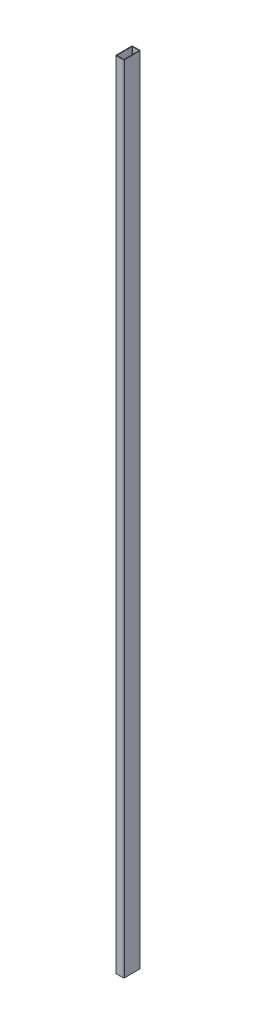
ISO-10303-21;
HEADER;
FILE_DESCRIPTION(('STEP AP214'),'2;1');
FILE_NAME('part.step','',(''),(''),'','','');
FILE_SCHEMA(('AUTOMOTIVE_DESIGN { 1 0 10303 214 1 1 1 1 }'));
ENDSEC;
DATA;
#1=APPLICATION_CONTEXT('core data for automotive mechanical design processes');
#2=APPLICATION_PROTOCOL_DEFINITION('international standard','automotive_design',2000,#1);
#3=PRODUCT_CONTEXT('',#1,'mechanical');
#4=PRODUCT('Part','Part','',(#3));
#5=PRODUCT_RELATED_PRODUCT_CATEGORY('part','',(#4));
#6=PRODUCT_DEFINITION_FORMATION('','',#4);
#7=PRODUCT_DEFINITION_CONTEXT('part definition',#1,'design');
#8=PRODUCT_DEFINITION('design','',#6,#7);
#9=PRODUCT_DEFINITION_SHAPE('','',#8);
#10=(LENGTH_UNIT() NAMED_UNIT(*) SI_UNIT(.MILLI.,.METRE.));
#11=(NAMED_UNIT(*) PLANE_ANGLE_UNIT() SI_UNIT($,.RADIAN.));
#12=(NAMED_UNIT(*) SI_UNIT($,.STERADIAN.) SOLID_ANGLE_UNIT());
#13=UNCERTAINTY_MEASURE_WITH_UNIT(LENGTH_MEASURE(1.E-05),#10,'distance_accuracy_value','');
#14=(GEOMETRIC_REPRESENTATION_CONTEXT(3) GLOBAL_UNCERTAINTY_ASSIGNED_CONTEXT((#13)) GLOBAL_UNIT_ASSIGNED_CONTEXT((#10,
#11,#12)) REPRESENTATION_CONTEXT('',''));
#15=CARTESIAN_POINT('',(0.,0.,0.));
#16=DIRECTION('',(0.,0.,1.));
#17=DIRECTION('',(1.,0.,0.));
#18=AXIS2_PLACEMENT_3D('',#15,#16,#17);
#19=CARTESIAN_POINT('',(20.0000000000001,1964.72135955,-18.5));
#20=DIRECTION('',(-1.,0.,0.));
#21=DIRECTION('',(0.,0.,1.));
#22=AXIS2_PLACEMENT_3D('',#19,#20,#21);
#23=PLANE('',#22);
#24=DIRECTION('',(0.,0.,-1.));
#25=VECTOR('',#24,1.);
#26=CARTESIAN_POINT('',(20.0000000000001,1920.,-18.5));
#27=LINE('',#26,#25);
#28=CARTESIAN_POINT('',(20.0000000000001,1920.,18.4999999999999));
#29=VERTEX_POINT('',#28);
#30=CARTESIAN_POINT('',(20.0000000000001,1920.,-18.5));
#31=VERTEX_POINT('',#30);
#32=EDGE_CURVE('E306',#29,#31,#27,.T.);
#33=ORIENTED_EDGE('',*,*,#32,.F.);
#34=DIRECTION('',(0.,-1.,0.));
#35=VECTOR('',#34,1.);
#36=CARTESIAN_POINT('',(20.0000000000001,1964.72135955,18.4999999999999));
#37=LINE('',#36,#35);
#38=CARTESIAN_POINT('',(20.0000000000001,0.,18.4999999999999));
#39=VERTEX_POINT('',#38);
#40=EDGE_CURVE('E50',#29,#39,#37,.T.);
#41=ORIENTED_EDGE('',*,*,#40,.T.);
#42=DIRECTION('',(0.,0.,-1.));
#43=VECTOR('',#42,1.);
#44=CARTESIAN_POINT('',(20.0000000000001,0.,-18.5));
#45=LINE('',#44,#43);
#46=CARTESIAN_POINT('',(20.0000000000001,0.,-18.5));
#47=VERTEX_POINT('',#46);
#48=EDGE_CURVE('E201',#39,#47,#45,.T.);
#49=ORIENTED_EDGE('',*,*,#48,.T.);
#50=DIRECTION('',(0.,-1.,0.));
#51=VECTOR('',#50,1.);
#52=CARTESIAN_POINT('',(20.0000000000001,1964.72135955,-18.5));
#53=LINE('',#52,#51);
#54=EDGE_CURVE('E204',#31,#47,#53,.T.);
#55=ORIENTED_EDGE('',*,*,#54,.F.);
#56=EDGE_LOOP('',(#33,#41,#49,#55));
#57=FACE_BOUND('',#56,.T.);
#58=ADVANCED_FACE('F35',(#57),#23,.F.);
#59=CARTESIAN_POINT('',(18.5000000000001,1964.72135955,18.4999999999999));
#60=DIRECTION('',(0.,-1.,0.));
#61=DIRECTION('',(0.,0.,-1.));
#62=AXIS2_PLACEMENT_3D('',#59,#60,#61);
#63=CYLINDRICAL_SURFACE('',#62,1.5);
#64=CARTESIAN_POINT('',(18.5000000000001,1920.,18.4999999999999));
#65=DIRECTION('',(0.,1.,0.));
#66=DIRECTION('',(0.,0.,1.));
#67=AXIS2_PLACEMENT_3D('',#64,#65,#66);
#68=CIRCLE('',#67,1.5);
#69=CARTESIAN_POINT('',(18.5000000000001,1920.,19.9999999999999));
#70=VERTEX_POINT('',#69);
#71=EDGE_CURVE('E242',#70,#29,#68,.T.);
#72=ORIENTED_EDGE('',*,*,#71,.F.);
#73=DIRECTION('',(0.,-1.,0.));
#74=VECTOR('',#73,1.);
#75=CARTESIAN_POINT('',(18.5000000000001,1964.72135955,19.9999999999999));
#76=LINE('',#75,#74);
#77=CARTESIAN_POINT('',(18.5000000000001,0.,19.9999999999999));
#78=VERTEX_POINT('',#77);
#79=EDGE_CURVE('E207',#70,#78,#76,.T.);
#80=ORIENTED_EDGE('',*,*,#79,.T.);
#81=CARTESIAN_POINT('',(18.5000000000001,0.,18.4999999999999));
#82=DIRECTION('',(0.,1.,0.));
#83=DIRECTION('',(0.,0.,-1.));
#84=AXIS2_PLACEMENT_3D('',#81,#82,#83);
#85=CIRCLE('',#84,1.5);
#86=EDGE_CURVE('E199',#78,#39,#85,.T.);
#87=ORIENTED_EDGE('',*,*,#86,.T.);
#88=ORIENTED_EDGE('',*,*,#40,.F.);
#89=EDGE_LOOP('',(#72,#80,#87,#88));
#90=FACE_BOUND('',#89,.T.);
#91=ADVANCED_FACE('F239',(#90),#63,.T.);
#92=CARTESIAN_POINT('',(1.50000000000008,1964.72135955,19.9999999999999));
#93=DIRECTION('',(0.,0.,-1.));
#94=DIRECTION('',(-1.,0.,0.));
#95=AXIS2_PLACEMENT_3D('',#92,#93,#94);
#96=PLANE('',#95);
#97=DIRECTION('',(1.,0.,0.));
#98=VECTOR('',#97,1.);
#99=CARTESIAN_POINT('',(1.50000000000008,1920.,19.9999999999999));
#100=LINE('',#99,#98);
#101=CARTESIAN_POINT('',(1.50000000000008,1920.,19.9999999999999));
#102=VERTEX_POINT('',#101);
#103=EDGE_CURVE('E247',#102,#70,#100,.T.);
#104=ORIENTED_EDGE('',*,*,#103,.F.);
#105=DIRECTION('',(0.,-1.,0.));
#106=VECTOR('',#105,1.);
#107=CARTESIAN_POINT('',(1.50000000000008,1964.72135955,19.9999999999999));
#108=LINE('',#107,#106);
#109=CARTESIAN_POINT('',(1.50000000000008,0.,19.9999999999999));
#110=VERTEX_POINT('',#109);
#111=EDGE_CURVE('E209',#102,#110,#108,.T.);
#112=ORIENTED_EDGE('',*,*,#111,.T.);
#113=DIRECTION('',(1.,0.,0.));
#114=VECTOR('',#113,1.);
#115=CARTESIAN_POINT('',(1.50000000000008,0.,19.9999999999999));
#116=LINE('',#115,#114);
#117=EDGE_CURVE('E196',#110,#78,#116,.T.);
#118=ORIENTED_EDGE('',*,*,#117,.T.);
#119=ORIENTED_EDGE('',*,*,#79,.F.);
#120=EDGE_LOOP('',(#104,#112,#118,#119));
#121=FACE_BOUND('',#120,.T.);
#122=ADVANCED_FACE('F245',(#121),#96,.F.);
#123=CARTESIAN_POINT('',(1.50000000000008,1964.72135955,18.4999999999999));
#124=DIRECTION('',(0.,-1.,0.));
#125=DIRECTION('',(0.,0.,-1.));
#126=AXIS2_PLACEMENT_3D('',#123,#124,#125);
#127=CYLINDRICAL_SURFACE('',#126,1.5);
#128=CARTESIAN_POINT('',(1.50000000000008,1920.,18.4999999999999));
#129=DIRECTION('',(0.,1.,0.));
#130=DIRECTION('',(0.,0.,1.));
#131=AXIS2_PLACEMENT_3D('',#128,#129,#130);
#132=CIRCLE('',#131,1.5);
#133=CARTESIAN_POINT('',(0.,1920.,18.4999999999999));
#134=VERTEX_POINT('',#133);
#135=EDGE_CURVE('E310',#134,#102,#132,.T.);
#136=ORIENTED_EDGE('',*,*,#135,.F.);
#137=DIRECTION('',(0.,-1.,0.));
#138=VECTOR('',#137,1.);
#139=CARTESIAN_POINT('',(0.,1964.72135955,18.4999999999999));
#140=LINE('',#139,#138);
#141=CARTESIAN_POINT('',(0.,0.,18.4999999999999));
#142=VERTEX_POINT('',#141);
#143=EDGE_CURVE('E211',#134,#142,#140,.T.);
#144=ORIENTED_EDGE('',*,*,#143,.T.);
#145=CARTESIAN_POINT('',(1.50000000000008,0.,18.4999999999999));
#146=DIRECTION('',(0.,1.,0.));
#147=DIRECTION('',(0.,0.,1.));
#148=AXIS2_PLACEMENT_3D('',#145,#146,#147);
#149=CIRCLE('',#148,1.5);
#150=EDGE_CURVE('E193',#142,#110,#149,.T.);
#151=ORIENTED_EDGE('',*,*,#150,.T.);
#152=ORIENTED_EDGE('',*,*,#111,.F.);
#153=EDGE_LOOP('',(#136,#144,#151,#152));
#154=FACE_BOUND('',#153,.T.);
#155=ADVANCED_FACE('F250',(#154),#127,.T.);
#156=CARTESIAN_POINT('',(0.,1964.72135955,-18.5000000000001));
#157=DIRECTION('',(1.,0.,0.));
#158=DIRECTION('',(0.,0.,-1.));
#159=AXIS2_PLACEMENT_3D('',#156,#157,#158);
#160=PLANE('',#159);
#161=DIRECTION('',(0.,0.,1.));
#162=VECTOR('',#161,1.);
#163=CARTESIAN_POINT('',(0.,1920.,-18.5000000000001));
#164=LINE('',#163,#162);
#165=CARTESIAN_POINT('',(0.,1920.,-18.5000000000001));
#166=VERTEX_POINT('',#165);
#167=EDGE_CURVE('E256',#166,#134,#164,.T.);
#168=ORIENTED_EDGE('',*,*,#167,.F.);
#169=DIRECTION('',(0.,-1.,0.));
#170=VECTOR('',#169,1.);
#171=CARTESIAN_POINT('',(0.,1964.72135955,-18.5000000000001));
#172=LINE('',#171,#170);
#173=CARTESIAN_POINT('',(0.,0.,-18.5000000000001));
#174=VERTEX_POINT('',#173);
#175=EDGE_CURVE('E213',#166,#174,#172,.T.);
#176=ORIENTED_EDGE('',*,*,#175,.T.);
#177=DIRECTION('',(0.,0.,1.));
#178=VECTOR('',#177,1.);
#179=CARTESIAN_POINT('',(0.,0.,-18.5000000000001));
#180=LINE('',#179,#178);
#181=EDGE_CURVE('E190',#174,#142,#180,.T.);
#182=ORIENTED_EDGE('',*,*,#181,.T.);
#183=ORIENTED_EDGE('',*,*,#143,.F.);
#184=EDGE_LOOP('',(#168,#176,#182,#183));
#185=FACE_BOUND('',#184,.T.);
#186=ADVANCED_FACE('F253',(#185),#160,.F.);
#187=CARTESIAN_POINT('',(1.50000000000008,1964.72135955,-18.5000000000001));
#188=DIRECTION('',(0.,-1.,0.));
#189=DIRECTION('',(0.,0.,-1.));
#190=AXIS2_PLACEMENT_3D('',#187,#188,#189);
#191=CYLINDRICAL_SURFACE('',#190,1.50000000000001);
#192=CARTESIAN_POINT('',(1.50000000000008,1920.,-18.5000000000001));
#193=DIRECTION('',(0.,1.,0.));
#194=DIRECTION('',(0.,0.,1.));
#195=AXIS2_PLACEMENT_3D('',#192,#193,#194);
#196=CIRCLE('',#195,1.50000000000001);
#197=CARTESIAN_POINT('',(1.50000000000008,1920.,-20.0000000000001));
#198=VERTEX_POINT('',#197);
#199=EDGE_CURVE('E260',#198,#166,#196,.T.);
#200=ORIENTED_EDGE('',*,*,#199,.F.);
#201=DIRECTION('',(0.,-1.,0.));
#202=VECTOR('',#201,1.);
#203=CARTESIAN_POINT('',(1.50000000000008,1964.72135955,-20.0000000000001));
#204=LINE('',#203,#202);
#205=CARTESIAN_POINT('',(1.50000000000008,0.,-20.0000000000001));
#206=VERTEX_POINT('',#205);
#207=EDGE_CURVE('E215',#198,#206,#204,.T.);
#208=ORIENTED_EDGE('',*,*,#207,.T.);
#209=CARTESIAN_POINT('',(1.50000000000008,0.,-18.5000000000001));
#210=DIRECTION('',(0.,1.,0.));
#211=DIRECTION('',(0.,0.,-1.));
#212=AXIS2_PLACEMENT_3D('',#209,#210,#211);
#213=CIRCLE('',#212,1.50000000000001);
#214=EDGE_CURVE('E187',#206,#174,#213,.T.);
#215=ORIENTED_EDGE('',*,*,#214,.T.);
#216=ORIENTED_EDGE('',*,*,#175,.F.);
#217=EDGE_LOOP('',(#200,#208,#215,#216));
#218=FACE_BOUND('',#217,.T.);
#219=ADVANCED_FACE('F259',(#218),#191,.T.);
#220=CARTESIAN_POINT('',(1.50000000000008,1964.72135955,-20.0000000000001));
#221=DIRECTION('',(0.,0.,1.));
#222=DIRECTION('',(1.,0.,0.));
#223=AXIS2_PLACEMENT_3D('',#220,#221,#222);
#224=PLANE('',#223);
#225=DIRECTION('',(-1.,0.,0.));
#226=VECTOR('',#225,1.);
#227=CARTESIAN_POINT('',(1.50000000000008,1920.,-20.0000000000001));
#228=LINE('',#227,#226);
#229=CARTESIAN_POINT('',(18.5000000000001,1920.,-20.0000000000001));
#230=VERTEX_POINT('',#229);
#231=EDGE_CURVE('E223',#230,#198,#228,.T.);
#232=ORIENTED_EDGE('',*,*,#231,.F.);
#233=DIRECTION('',(0.,-1.,0.));
#234=VECTOR('',#233,1.);
#235=CARTESIAN_POINT('',(18.5000000000001,1964.72135955,-20.0000000000001));
#236=LINE('',#235,#234);
#237=CARTESIAN_POINT('',(18.5000000000001,0.,-20.0000000000001));
#238=VERTEX_POINT('',#237);
#239=EDGE_CURVE('E43',#230,#238,#236,.T.);
#240=ORIENTED_EDGE('',*,*,#239,.T.);
#241=DIRECTION('',(-1.,0.,0.));
#242=VECTOR('',#241,1.);
#243=CARTESIAN_POINT('',(1.50000000000008,0.,-20.0000000000001));
#244=LINE('',#243,#242);
#245=EDGE_CURVE('E184',#238,#206,#244,.T.);
#246=ORIENTED_EDGE('',*,*,#245,.T.);
#247=ORIENTED_EDGE('',*,*,#207,.F.);
#248=EDGE_LOOP('',(#232,#240,#246,#247));
#249=FACE_BOUND('',#248,.T.);
#250=ADVANCED_FACE('F219',(#249),#224,.F.);
#251=CARTESIAN_POINT('',(18.5000000000001,1964.72135955,-18.5));
#252=DIRECTION('',(0.,-1.,0.));
#253=DIRECTION('',(0.,0.,-1.));
#254=AXIS2_PLACEMENT_3D('',#251,#252,#253);
#255=CYLINDRICAL_SURFACE('',#254,1.5);
#256=CARTESIAN_POINT('',(18.5000000000001,1920.,-18.5));
#257=DIRECTION('',(0.,1.,0.));
#258=DIRECTION('',(0.,0.,1.));
#259=AXIS2_PLACEMENT_3D('',#256,#257,#258);
#260=CIRCLE('',#259,1.5);
#261=EDGE_CURVE('E233',#31,#230,#260,.T.);
#262=ORIENTED_EDGE('',*,*,#261,.F.);
#263=ORIENTED_EDGE('',*,*,#54,.T.);
#264=CARTESIAN_POINT('',(18.5000000000001,0.,-18.5));
#265=DIRECTION('',(0.,1.,0.));
#266=DIRECTION('',(0.,0.,-1.));
#267=AXIS2_PLACEMENT_3D('',#264,#265,#266);
#268=CIRCLE('',#267,1.5);
#269=EDGE_CURVE('E181',#47,#238,#268,.T.);
#270=ORIENTED_EDGE('',*,*,#269,.T.);
#271=ORIENTED_EDGE('',*,*,#239,.F.);
#272=EDGE_LOOP('',(#262,#263,#270,#271));
#273=FACE_BOUND('',#272,.T.);
#274=ADVANCED_FACE('F37',(#273),#255,.T.);
#275=CARTESIAN_POINT('',(18.5000000000001,0.,-18.5));
#276=DIRECTION('',(0.,-1.,0.));
#277=DIRECTION('',(0.,0.,-1.));
#278=AXIS2_PLACEMENT_3D('',#275,#276,#277);
#279=PLANE('',#278);
#280=ORIENTED_EDGE('',*,*,#269,.F.);
#281=ORIENTED_EDGE('',*,*,#48,.F.);
#282=ORIENTED_EDGE('',*,*,#86,.F.);
#283=ORIENTED_EDGE('',*,*,#117,.F.);
#284=ORIENTED_EDGE('',*,*,#150,.F.);
#285=ORIENTED_EDGE('',*,*,#181,.F.);
#286=ORIENTED_EDGE('',*,*,#214,.F.);
#287=ORIENTED_EDGE('',*,*,#245,.F.);
#288=EDGE_LOOP('',(#280,#281,#282,#283,#284,#285,#286,#287));
#289=FACE_BOUND('',#288,.T.);
#290=DIRECTION('',(1.,0.,0.));
#291=VECTOR('',#290,1.);
#292=CARTESIAN_POINT('',(2.50000000000008,0.,18.4999999999999));
#293=LINE('',#292,#291);
#294=CARTESIAN_POINT('',(2.50000000000008,0.,18.4999999999999));
#295=VERTEX_POINT('',#294);
#296=CARTESIAN_POINT('',(17.5000000000001,0.,18.4999999999999));
#297=VERTEX_POINT('',#296);
#298=EDGE_CURVE('E163',#295,#297,#293,.T.);
#299=ORIENTED_EDGE('',*,*,#298,.T.);
#300=CARTESIAN_POINT('',(17.5000000000001,0.,17.4999999999999));
#301=DIRECTION('',(0.,1.,0.));
#302=DIRECTION('',(0.,0.,-1.));
#303=AXIS2_PLACEMENT_3D('',#300,#301,#302);
#304=CIRCLE('',#303,0.999999999999994);
#305=CARTESIAN_POINT('',(18.5000000000001,0.,17.4999999999999));
#306=VERTEX_POINT('',#305);
#307=EDGE_CURVE('E262',#297,#306,#304,.T.);
#308=ORIENTED_EDGE('',*,*,#307,.T.);
#309=DIRECTION('',(0.,0.,-1.));
#310=VECTOR('',#309,1.);
#311=CARTESIAN_POINT('',(18.5000000000001,0.,-17.5));
#312=LINE('',#311,#310);
#313=CARTESIAN_POINT('',(18.5000000000001,0.,-17.5));
#314=VERTEX_POINT('',#313);
#315=EDGE_CURVE('E269',#306,#314,#312,.T.);
#316=ORIENTED_EDGE('',*,*,#315,.T.);
#317=CARTESIAN_POINT('',(17.5000000000001,0.,-17.5));
#318=DIRECTION('',(0.,1.,0.));
#319=DIRECTION('',(0.,0.,-1.));
#320=AXIS2_PLACEMENT_3D('',#317,#318,#319);
#321=CIRCLE('',#320,1.);
#322=CARTESIAN_POINT('',(17.5000000000001,0.,-18.5000000000001));
#323=VERTEX_POINT('',#322);
#324=EDGE_CURVE('E272',#314,#323,#321,.T.);
#325=ORIENTED_EDGE('',*,*,#324,.T.);
#326=DIRECTION('',(-1.,0.,0.));
#327=VECTOR('',#326,1.);
#328=CARTESIAN_POINT('',(2.50000000000009,0.,-18.5000000000001));
#329=LINE('',#328,#327);
#330=CARTESIAN_POINT('',(2.50000000000009,0.,-18.5000000000001));
#331=VERTEX_POINT('',#330);
#332=EDGE_CURVE('E275',#323,#331,#329,.T.);
#333=ORIENTED_EDGE('',*,*,#332,.T.);
#334=CARTESIAN_POINT('',(2.50000000000009,0.,-17.5000000000001));
#335=DIRECTION('',(0.,1.,0.));
#336=DIRECTION('',(0.,0.,-1.));
#337=AXIS2_PLACEMENT_3D('',#334,#335,#336);
#338=CIRCLE('',#337,1.);
#339=CARTESIAN_POINT('',(1.50000000000008,0.,-17.5000000000001));
#340=VERTEX_POINT('',#339);
#341=EDGE_CURVE('E278',#331,#340,#338,.T.);
#342=ORIENTED_EDGE('',*,*,#341,.T.);
#343=DIRECTION('',(0.,0.,1.));
#344=VECTOR('',#343,1.);
#345=CARTESIAN_POINT('',(1.50000000000008,0.,-17.5000000000001));
#346=LINE('',#345,#344);
#347=CARTESIAN_POINT('',(1.50000000000009,0.,17.4999999999999));
#348=VERTEX_POINT('',#347);
#349=EDGE_CURVE('E281',#340,#348,#346,.T.);
#350=ORIENTED_EDGE('',*,*,#349,.T.);
#351=CARTESIAN_POINT('',(2.50000000000008,0.,17.4999999999999));
#352=DIRECTION('',(0.,1.,0.));
#353=DIRECTION('',(0.,0.,1.));
#354=AXIS2_PLACEMENT_3D('',#351,#352,#353);
#355=CIRCLE('',#354,0.999999999999997);
#356=EDGE_CURVE('E284',#348,#295,#355,.T.);
#357=ORIENTED_EDGE('',*,*,#356,.T.);
#358=EDGE_LOOP('',(#299,#308,#316,#325,#333,#342,#350,#357));
#359=FACE_BOUND('',#358,.T.);
#360=ADVANCED_FACE('F229',(#289,#359),#279,.T.);
#361=CARTESIAN_POINT('',(2.50000000000008,1964.72135955,18.4999999999999));
#362=DIRECTION('',(0.,0.,-1.));
#363=DIRECTION('',(-1.,0.,0.));
#364=AXIS2_PLACEMENT_3D('',#361,#362,#363);
#365=PLANE('',#364);
#366=DIRECTION('',(0.,-1.,0.));
#367=VECTOR('',#366,1.);
#368=CARTESIAN_POINT('',(2.50000000000008,1964.72135955,18.4999999999999));
#369=LINE('',#368,#367);
#370=CARTESIAN_POINT('',(2.50000000000008,1920.,18.4999999999999));
#371=VERTEX_POINT('',#370);
#372=EDGE_CURVE('E155',#371,#295,#369,.T.);
#373=ORIENTED_EDGE('',*,*,#372,.F.);
#374=DIRECTION('',(1.,0.,0.));
#375=VECTOR('',#374,1.);
#376=CARTESIAN_POINT('',(2.50000000000008,1920.,18.4999999999999));
#377=LINE('',#376,#375);
#378=CARTESIAN_POINT('',(17.5000000000001,1920.,18.4999999999999));
#379=VERTEX_POINT('',#378);
#380=EDGE_CURVE('E11',#371,#379,#377,.T.);
#381=ORIENTED_EDGE('',*,*,#380,.T.);
#382=DIRECTION('',(0.,-1.,0.));
#383=VECTOR('',#382,1.);
#384=CARTESIAN_POINT('',(17.5000000000001,1964.72135955,18.4999999999999));
#385=LINE('',#384,#383);
#386=EDGE_CURVE('E165',#379,#297,#385,.T.);
#387=ORIENTED_EDGE('',*,*,#386,.T.);
#388=ORIENTED_EDGE('',*,*,#298,.F.);
#389=EDGE_LOOP('',(#373,#381,#387,#388));
#390=FACE_BOUND('',#389,.T.);
#391=ADVANCED_FACE('F161',(#390),#365,.T.);
#392=CARTESIAN_POINT('',(2.50000000000008,1964.72135955,17.4999999999999));
#393=DIRECTION('',(0.,-1.,0.));
#394=DIRECTION('',(0.,0.,-1.));
#395=AXIS2_PLACEMENT_3D('',#392,#393,#394);
#396=CYLINDRICAL_SURFACE('',#395,0.999999999999997);
#397=DIRECTION('',(0.,-1.,0.));
#398=VECTOR('',#397,1.);
#399=CARTESIAN_POINT('',(1.50000000000009,1964.72135955,17.4999999999999));
#400=LINE('',#399,#398);
#401=CARTESIAN_POINT('',(1.50000000000008,1920.,17.4999999999999));
#402=VERTEX_POINT('',#401);
#403=EDGE_CURVE('E157',#402,#348,#400,.T.);
#404=ORIENTED_EDGE('',*,*,#403,.F.);
#405=CARTESIAN_POINT('',(2.50000000000008,1920.,17.4999999999999));
#406=DIRECTION('',(0.,1.,0.));
#407=DIRECTION('',(0.,0.,1.));
#408=AXIS2_PLACEMENT_3D('',#405,#406,#407);
#409=CIRCLE('',#408,0.999999999999997);
#410=EDGE_CURVE('E148',#402,#371,#409,.T.);
#411=ORIENTED_EDGE('',*,*,#410,.T.);
#412=ORIENTED_EDGE('',*,*,#372,.T.);
#413=ORIENTED_EDGE('',*,*,#356,.F.);
#414=EDGE_LOOP('',(#404,#411,#412,#413));
#415=FACE_BOUND('',#414,.T.);
#416=ADVANCED_FACE('F153',(#415),#396,.F.);
#417=CARTESIAN_POINT('',(1.50000000000008,1964.72135955,-17.5000000000001));
#418=DIRECTION('',(1.,0.,0.));
#419=DIRECTION('',(0.,0.,-1.));
#420=AXIS2_PLACEMENT_3D('',#417,#418,#419);
#421=PLANE('',#420);
#422=DIRECTION('',(0.,-1.,0.));
#423=VECTOR('',#422,1.);
#424=CARTESIAN_POINT('',(1.50000000000008,1964.72135955,-17.5000000000001));
#425=LINE('',#424,#423);
#426=CARTESIAN_POINT('',(1.50000000000008,1920.,-17.5000000000001));
#427=VERTEX_POINT('',#426);
#428=EDGE_CURVE('E167',#427,#340,#425,.T.);
#429=ORIENTED_EDGE('',*,*,#428,.F.);
#430=DIRECTION('',(0.,0.,1.));
#431=VECTOR('',#430,1.);
#432=CARTESIAN_POINT('',(1.50000000000008,1920.,-17.5000000000001));
#433=LINE('',#432,#431);
#434=EDGE_CURVE('E159',#427,#402,#433,.T.);
#435=ORIENTED_EDGE('',*,*,#434,.T.);
#436=ORIENTED_EDGE('',*,*,#403,.T.);
#437=ORIENTED_EDGE('',*,*,#349,.F.);
#438=EDGE_LOOP('',(#429,#435,#436,#437));
#439=FACE_BOUND('',#438,.T.);
#440=ADVANCED_FACE('F290',(#439),#421,.T.);
#441=CARTESIAN_POINT('',(2.50000000000009,1964.72135955,-17.5000000000001));
#442=DIRECTION('',(0.,-1.,0.));
#443=DIRECTION('',(0.,0.,-1.));
#444=AXIS2_PLACEMENT_3D('',#441,#442,#443);
#445=CYLINDRICAL_SURFACE('',#444,1.);
#446=DIRECTION('',(0.,-1.,0.));
#447=VECTOR('',#446,1.);
#448=CARTESIAN_POINT('',(2.50000000000009,1964.72135955,-18.5000000000001));
#449=LINE('',#448,#447);
#450=CARTESIAN_POINT('',(2.50000000000009,1920.,-18.5000000000001));
#451=VERTEX_POINT('',#450);
#452=EDGE_CURVE('E173',#451,#331,#449,.T.);
#453=ORIENTED_EDGE('',*,*,#452,.F.);
#454=CARTESIAN_POINT('',(2.50000000000009,1920.,-17.5000000000001));
#455=DIRECTION('',(0.,1.,0.));
#456=DIRECTION('',(0.,0.,1.));
#457=AXIS2_PLACEMENT_3D('',#454,#455,#456);
#458=CIRCLE('',#457,1.);
#459=EDGE_CURVE('E292',#451,#427,#458,.T.);
#460=ORIENTED_EDGE('',*,*,#459,.T.);
#461=ORIENTED_EDGE('',*,*,#428,.T.);
#462=ORIENTED_EDGE('',*,*,#341,.F.);
#463=EDGE_LOOP('',(#453,#460,#461,#462));
#464=FACE_BOUND('',#463,.T.);
#465=ADVANCED_FACE('F327',(#464),#445,.F.);
#466=CARTESIAN_POINT('',(2.50000000000009,1964.72135955,-18.5000000000001));
#467=DIRECTION('',(0.,0.,1.));
#468=DIRECTION('',(1.,0.,0.));
#469=AXIS2_PLACEMENT_3D('',#466,#467,#468);
#470=PLANE('',#469);
#471=DIRECTION('',(0.,-1.,0.));
#472=VECTOR('',#471,1.);
#473=CARTESIAN_POINT('',(17.5000000000001,1964.72135955,-18.5000000000001));
#474=LINE('',#473,#472);
#475=CARTESIAN_POINT('',(17.5000000000001,1920.,-18.5000000000001));
#476=VERTEX_POINT('',#475);
#477=EDGE_CURVE('E175',#476,#323,#474,.T.);
#478=ORIENTED_EDGE('',*,*,#477,.F.);
#479=DIRECTION('',(-1.,0.,0.));
#480=VECTOR('',#479,1.);
#481=CARTESIAN_POINT('',(2.50000000000009,1920.,-18.5000000000001));
#482=LINE('',#481,#480);
#483=EDGE_CURVE('E294',#476,#451,#482,.T.);
#484=ORIENTED_EDGE('',*,*,#483,.T.);
#485=ORIENTED_EDGE('',*,*,#452,.T.);
#486=ORIENTED_EDGE('',*,*,#332,.F.);
#487=EDGE_LOOP('',(#478,#484,#485,#486));
#488=FACE_BOUND('',#487,.T.);
#489=ADVANCED_FACE('F324',(#488),#470,.T.);
#490=CARTESIAN_POINT('',(17.5000000000001,1964.72135955,-17.5));
#491=DIRECTION('',(0.,-1.,0.));
#492=DIRECTION('',(0.,0.,-1.));
#493=AXIS2_PLACEMENT_3D('',#490,#491,#492);
#494=CYLINDRICAL_SURFACE('',#493,1.);
#495=DIRECTION('',(0.,-1.,0.));
#496=VECTOR('',#495,1.);
#497=CARTESIAN_POINT('',(18.5000000000001,1964.72135955,-17.5));
#498=LINE('',#497,#496);
#499=CARTESIAN_POINT('',(18.5000000000001,1920.,-17.5));
#500=VERTEX_POINT('',#499);
#501=EDGE_CURVE('E177',#500,#314,#498,.T.);
#502=ORIENTED_EDGE('',*,*,#501,.F.);
#503=CARTESIAN_POINT('',(17.5000000000001,1920.,-17.5));
#504=DIRECTION('',(0.,1.,0.));
#505=DIRECTION('',(0.,0.,1.));
#506=AXIS2_PLACEMENT_3D('',#503,#504,#505);
#507=CIRCLE('',#506,1.);
#508=EDGE_CURVE('E299',#500,#476,#507,.T.);
#509=ORIENTED_EDGE('',*,*,#508,.T.);
#510=ORIENTED_EDGE('',*,*,#477,.T.);
#511=ORIENTED_EDGE('',*,*,#324,.F.);
#512=EDGE_LOOP('',(#502,#509,#510,#511));
#513=FACE_BOUND('',#512,.T.);
#514=ADVANCED_FACE('F321',(#513),#494,.F.);
#515=CARTESIAN_POINT('',(18.5000000000001,1964.72135955,-17.5));
#516=DIRECTION('',(-1.,0.,0.));
#517=DIRECTION('',(0.,0.,1.));
#518=AXIS2_PLACEMENT_3D('',#515,#516,#517);
#519=PLANE('',#518);
#520=DIRECTION('',(0.,-1.,0.));
#521=VECTOR('',#520,1.);
#522=CARTESIAN_POINT('',(18.5000000000001,1964.72135955,17.4999999999999));
#523=LINE('',#522,#521);
#524=CARTESIAN_POINT('',(18.5000000000001,1920.,17.4999999999999));
#525=VERTEX_POINT('',#524);
#526=EDGE_CURVE('E179',#525,#306,#523,.T.);
#527=ORIENTED_EDGE('',*,*,#526,.F.);
#528=DIRECTION('',(0.,0.,-1.));
#529=VECTOR('',#528,1.);
#530=CARTESIAN_POINT('',(18.5000000000001,1920.,-17.5));
#531=LINE('',#530,#529);
#532=EDGE_CURVE('E302',#525,#500,#531,.T.);
#533=ORIENTED_EDGE('',*,*,#532,.T.);
#534=ORIENTED_EDGE('',*,*,#501,.T.);
#535=ORIENTED_EDGE('',*,*,#315,.F.);
#536=EDGE_LOOP('',(#527,#533,#534,#535));
#537=FACE_BOUND('',#536,.T.);
#538=ADVANCED_FACE('F316',(#537),#519,.T.);
#539=CARTESIAN_POINT('',(17.5000000000001,1964.72135955,17.4999999999999));
#540=DIRECTION('',(0.,-1.,0.));
#541=DIRECTION('',(0.,0.,-1.));
#542=AXIS2_PLACEMENT_3D('',#539,#540,#541);
#543=CYLINDRICAL_SURFACE('',#542,0.999999999999994);
#544=ORIENTED_EDGE('',*,*,#386,.F.);
#545=CARTESIAN_POINT('',(17.5000000000001,1920.,17.4999999999999));
#546=DIRECTION('',(0.,1.,0.));
#547=DIRECTION('',(0.,0.,1.));
#548=AXIS2_PLACEMENT_3D('',#545,#546,#547);
#549=CIRCLE('',#548,0.999999999999994);
#550=EDGE_CURVE('E58',#379,#525,#549,.T.);
#551=ORIENTED_EDGE('',*,*,#550,.T.);
#552=ORIENTED_EDGE('',*,*,#526,.T.);
#553=ORIENTED_EDGE('',*,*,#307,.F.);
#554=EDGE_LOOP('',(#544,#551,#552,#553));
#555=FACE_BOUND('',#554,.T.);
#556=ADVANCED_FACE('F312',(#555),#543,.F.);
#557=CARTESIAN_POINT('',(1.49999999999998,1920.,1000.));
#558=DIRECTION('',(0.,1.,0.));
#559=DIRECTION('',(0.,0.,1.));
#560=AXIS2_PLACEMENT_3D('',#557,#558,#559);
#561=PLANE('',#560);
#562=ORIENTED_EDGE('',*,*,#550,.F.);
#563=ORIENTED_EDGE('',*,*,#380,.F.);
#564=ORIENTED_EDGE('',*,*,#410,.F.);
#565=ORIENTED_EDGE('',*,*,#434,.F.);
#566=ORIENTED_EDGE('',*,*,#459,.F.);
#567=ORIENTED_EDGE('',*,*,#483,.F.);
#568=ORIENTED_EDGE('',*,*,#508,.F.);
#569=ORIENTED_EDGE('',*,*,#532,.F.);
#570=EDGE_LOOP('',(#562,#563,#564,#565,#566,#567,#568,#569));
#571=FACE_BOUND('',#570,.T.);
#572=ORIENTED_EDGE('',*,*,#32,.T.);
#573=ORIENTED_EDGE('',*,*,#261,.T.);
#574=ORIENTED_EDGE('',*,*,#231,.T.);
#575=ORIENTED_EDGE('',*,*,#199,.T.);
#576=ORIENTED_EDGE('',*,*,#167,.T.);
#577=ORIENTED_EDGE('',*,*,#135,.T.);
#578=ORIENTED_EDGE('',*,*,#103,.T.);
#579=ORIENTED_EDGE('',*,*,#71,.T.);
#580=EDGE_LOOP('',(#572,#573,#574,#575,#576,#577,#578,#579));
#581=FACE_BOUND('',#580,.T.);
#582=ADVANCED_FACE('F146',(#571,#581),#561,.T.);
#583=CLOSED_SHELL('',(#58,#91,#122,#155,#186,#219,#250,#274,#360,#391,#416,#440,#465,#489,#514,
#538,#556,#582));
#584=MANIFOLD_SOLID_BREP('B2',#583);
#585=ADVANCED_BREP_SHAPE_REPRESENTATION('',(#18,#584),#14);
#586=SHAPE_DEFINITION_REPRESENTATION(#9,#585);
ENDSEC;
END-ISO-10303-21;
